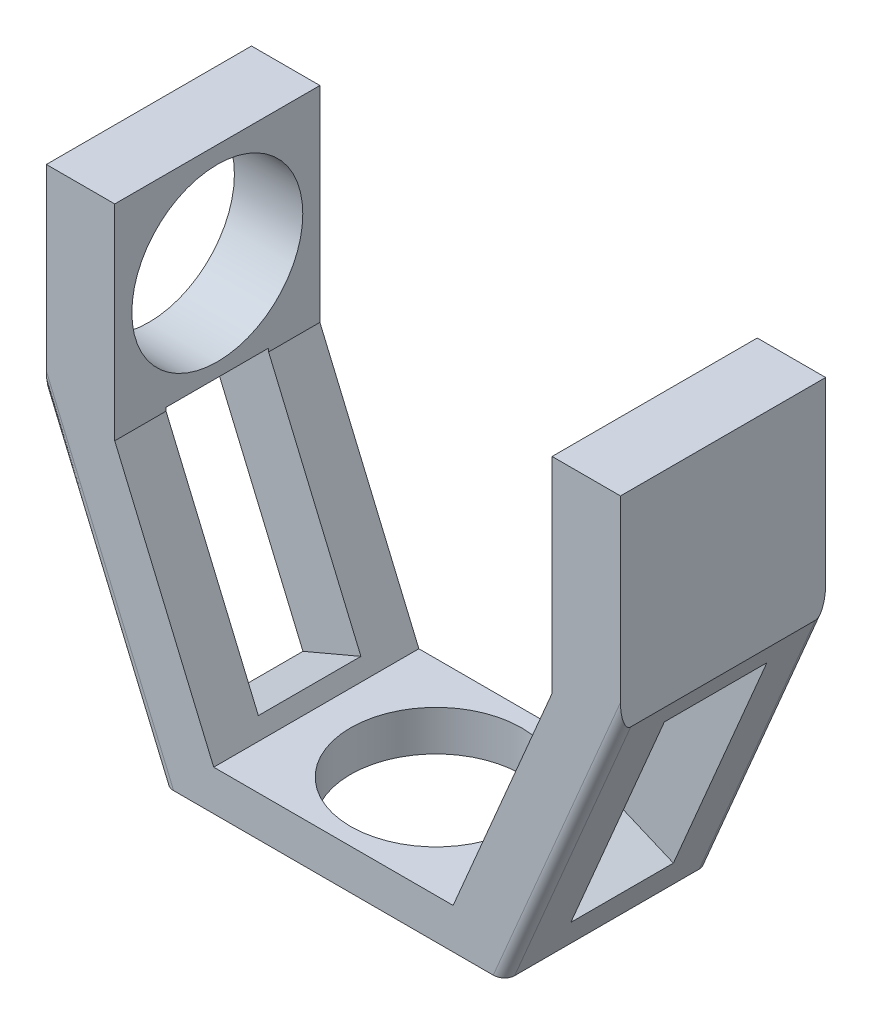
ISO-10303-21;
HEADER;
FILE_DESCRIPTION(('STEP AP214'),'2;1');
FILE_NAME('part.step','',(''),(''),'','','');
FILE_SCHEMA(('AUTOMOTIVE_DESIGN { 1 0 10303 214 1 1 1 1 }'));
ENDSEC;
DATA;
#1=APPLICATION_CONTEXT('core data for automotive mechanical design processes');
#2=APPLICATION_PROTOCOL_DEFINITION('international standard','automotive_design',2000,#1);
#3=PRODUCT_CONTEXT('',#1,'mechanical');
#4=PRODUCT('Part','Part','',(#3));
#5=PRODUCT_RELATED_PRODUCT_CATEGORY('part','',(#4));
#6=PRODUCT_DEFINITION_FORMATION('','',#4);
#7=PRODUCT_DEFINITION_CONTEXT('part definition',#1,'design');
#8=PRODUCT_DEFINITION('design','',#6,#7);
#9=PRODUCT_DEFINITION_SHAPE('','',#8);
#10=(LENGTH_UNIT() NAMED_UNIT(*) SI_UNIT(.MILLI.,.METRE.));
#11=(NAMED_UNIT(*) PLANE_ANGLE_UNIT() SI_UNIT($,.RADIAN.));
#12=(NAMED_UNIT(*) SI_UNIT($,.STERADIAN.) SOLID_ANGLE_UNIT());
#13=UNCERTAINTY_MEASURE_WITH_UNIT(LENGTH_MEASURE(1.E-05),#10,'distance_accuracy_value','');
#14=(GEOMETRIC_REPRESENTATION_CONTEXT(3) GLOBAL_UNCERTAINTY_ASSIGNED_CONTEXT((#13)) GLOBAL_UNIT_ASSIGNED_CONTEXT((#10,
#11,#12)) REPRESENTATION_CONTEXT('',''));
#15=CARTESIAN_POINT('',(0.,0.,0.));
#16=DIRECTION('',(0.,0.,1.));
#17=DIRECTION('',(1.,0.,0.));
#18=AXIS2_PLACEMENT_3D('',#15,#16,#17);
#19=CARTESIAN_POINT('',(6.13187876566639,76.9672773490026,60.));
#20=DIRECTION('',(0.,-1.,0.));
#21=DIRECTION('',(0.,0.,-1.));
#22=AXIS2_PLACEMENT_3D('',#19,#20,#21);
#23=PLANE('',#22);
#24=DIRECTION('',(-1.,0.,0.));
#25=VECTOR('',#24,1.);
#26=CARTESIAN_POINT('',(6.13187876566639,76.9672773490026,0.));
#27=LINE('',#26,#25);
#28=CARTESIAN_POINT('',(6.13187876566639,76.9672773490026,0.));
#29=VERTEX_POINT('',#28);
#30=CARTESIAN_POINT('',(-13.8681212343336,76.9672773490026,0.));
#31=VERTEX_POINT('',#30);
#32=EDGE_CURVE('E351',#29,#31,#27,.T.);
#33=ORIENTED_EDGE('',*,*,#32,.T.);
#34=DIRECTION('',(0.,0.,1.));
#35=VECTOR('',#34,1.);
#36=CARTESIAN_POINT('',(-13.8681212343336,76.9672773490026,0.));
#37=LINE('',#36,#35);
#38=CARTESIAN_POINT('',(-13.8681212343336,76.9672773490026,60.));
#39=VERTEX_POINT('',#38);
#40=EDGE_CURVE('E318',#31,#39,#37,.T.);
#41=ORIENTED_EDGE('',*,*,#40,.T.);
#42=DIRECTION('',(-1.,0.,0.));
#43=VECTOR('',#42,1.);
#44=CARTESIAN_POINT('',(6.13187876566639,76.9672773490026,60.));
#45=LINE('',#44,#43);
#46=CARTESIAN_POINT('',(6.13187876566639,76.9672773490026,60.));
#47=VERTEX_POINT('',#46);
#48=EDGE_CURVE('E339',#47,#39,#45,.T.);
#49=ORIENTED_EDGE('',*,*,#48,.F.);
#50=DIRECTION('',(0.,0.,-1.));
#51=VECTOR('',#50,1.);
#52=CARTESIAN_POINT('',(6.13187876566639,76.9672773490026,60.));
#53=LINE('',#52,#51);
#54=EDGE_CURVE('E369',#47,#29,#53,.T.);
#55=ORIENTED_EDGE('',*,*,#54,.T.);
#56=EDGE_LOOP('',(#33,#41,#49,#55));
#57=FACE_BOUND('',#56,.T.);
#58=ADVANCED_FACE('F37',(#57),#23,.F.);
#59=CARTESIAN_POINT('',(6.13187876566639,16.9672773490026,60.));
#60=DIRECTION('',(-1.,0.,0.));
#61=DIRECTION('',(0.,0.,1.));
#62=AXIS2_PLACEMENT_3D('',#59,#60,#61);
#63=PLANE('',#62);
#64=DIRECTION('',(0.,0.,-1.));
#65=VECTOR('',#64,1.);
#66=CARTESIAN_POINT('',(6.13187876566639,16.9672773490026,60.));
#67=LINE('',#66,#65);
#68=CARTESIAN_POINT('',(6.13187876566639,16.9672773490026,57.));
#69=VERTEX_POINT('',#68);
#70=CARTESIAN_POINT('',(6.13187876566639,16.9672773490026,3.));
#71=VERTEX_POINT('',#70);
#72=EDGE_CURVE('E348',#69,#71,#67,.T.);
#73=ORIENTED_EDGE('',*,*,#72,.T.);
#74=CARTESIAN_POINT('',(6.13187876566639,24.645191344745,3.));
#75=DIRECTION('',(-1.,0.,0.));
#76=DIRECTION('',(0.,1.,0.));
#77=AXIS2_PLACEMENT_3D('',#74,#75,#76);
#78=ELLIPSE('',#77,7.67791399574241,3.);
#79=CARTESIAN_POINT('',(6.13187876566639,24.645191344745,0.));
#80=VERTEX_POINT('',#79);
#81=EDGE_CURVE('E59',#71,#80,#78,.F.);
#82=ORIENTED_EDGE('',*,*,#81,.T.);
#83=DIRECTION('',(0.,1.,0.));
#84=VECTOR('',#83,1.);
#85=CARTESIAN_POINT('',(6.13187876566639,16.9672773490026,0.));
#86=LINE('',#85,#84);
#87=EDGE_CURVE('E321',#80,#29,#86,.T.);
#88=ORIENTED_EDGE('',*,*,#87,.T.);
#89=ORIENTED_EDGE('',*,*,#54,.F.);
#90=DIRECTION('',(0.,1.,0.));
#91=VECTOR('',#90,1.);
#92=CARTESIAN_POINT('',(6.13187876566639,16.9672773490026,60.));
#93=LINE('',#92,#91);
#94=CARTESIAN_POINT('',(6.13187876566639,24.645191344745,60.));
#95=VERTEX_POINT('',#94);
#96=EDGE_CURVE('E335',#95,#47,#93,.T.);
#97=ORIENTED_EDGE('',*,*,#96,.F.);
#98=CARTESIAN_POINT('',(6.13187876566639,24.645191344745,57.));
#99=DIRECTION('',(-1.,0.,0.));
#100=DIRECTION('',(0.,-1.,0.));
#101=AXIS2_PLACEMENT_3D('',#98,#99,#100);
#102=ELLIPSE('',#101,7.67791399574241,3.);
#103=EDGE_CURVE('E415',#95,#69,#102,.F.);
#104=ORIENTED_EDGE('',*,*,#103,.T.);
#105=EDGE_LOOP('',(#73,#82,#88,#89,#97,#104));
#106=FACE_BOUND('',#105,.T.);
#107=ADVANCED_FACE('F430',(#106),#63,.F.);
#108=CARTESIAN_POINT('',(-141.78409182787,76.9672773490026,60.));
#109=VERTEX_POINT('',#108);
#110=CARTESIAN_POINT('',(-161.78409182787,76.9672773490026,60.));
#111=VERTEX_POINT('',#110);
#112=EDGE_CURVE('E337',#109,#111,#45,.T.);
#113=ORIENTED_EDGE('',*,*,#112,.F.);
#114=DIRECTION('',(0.,0.,1.));
#115=VECTOR('',#114,1.);
#116=CARTESIAN_POINT('',(-141.78409182787,76.9672773490026,0.));
#117=LINE('',#116,#115);
#118=CARTESIAN_POINT('',(-141.78409182787,76.9672773490026,0.));
#119=VERTEX_POINT('',#118);
#120=EDGE_CURVE('E305',#119,#109,#117,.T.);
#121=ORIENTED_EDGE('',*,*,#120,.F.);
#122=CARTESIAN_POINT('',(-161.78409182787,76.9672773490026,0.));
#123=VERTEX_POINT('',#122);
#124=EDGE_CURVE('E350',#119,#123,#27,.T.);
#125=ORIENTED_EDGE('',*,*,#124,.T.);
#126=DIRECTION('',(0.,0.,-1.));
#127=VECTOR('',#126,1.);
#128=CARTESIAN_POINT('',(-161.78409182787,76.9672773490026,60.));
#129=LINE('',#128,#127);
#130=EDGE_CURVE('E366',#111,#123,#129,.T.);
#131=ORIENTED_EDGE('',*,*,#130,.F.);
#132=EDGE_LOOP('',(#113,#121,#125,#131));
#133=FACE_BOUND('',#132,.T.);
#134=ADVANCED_FACE('F453',(#133),#23,.F.);
#135=CARTESIAN_POINT('',(-161.78409182787,76.9672773490026,60.));
#136=DIRECTION('',(1.,0.,0.));
#137=DIRECTION('',(0.,1.,0.));
#138=AXIS2_PLACEMENT_3D('',#135,#136,#137);
#139=PLANE('',#138);
#140=CARTESIAN_POINT('',(-161.78409182787,46.9672773490026,30.));
#141=DIRECTION('',(-1.,0.,0.));
#142=DIRECTION('',(0.,-1.,0.));
#143=AXIS2_PLACEMENT_3D('',#140,#141,#142);
#144=CIRCLE('',#143,25.);
#145=CARTESIAN_POINT('',(-161.78409182787,21.9672773490026,30.));
#146=VERTEX_POINT('',#145);
#147=EDGE_CURVE('E282',#146,#146,#144,.T.);
#148=ORIENTED_EDGE('',*,*,#147,.F.);
#149=EDGE_LOOP('',(#148));
#150=FACE_BOUND('',#149,.T.);
#151=DIRECTION('',(0.,0.,-1.));
#152=VECTOR('',#151,1.);
#153=CARTESIAN_POINT('',(-161.78409182787,16.9672773490026,60.));
#154=LINE('',#153,#152);
#155=CARTESIAN_POINT('',(-161.78409182787,16.9672773490026,57.));
#156=VERTEX_POINT('',#155);
#157=CARTESIAN_POINT('',(-161.78409182787,16.9672773490026,3.));
#158=VERTEX_POINT('',#157);
#159=EDGE_CURVE('E364',#156,#158,#154,.T.);
#160=ORIENTED_EDGE('',*,*,#159,.F.);
#161=CARTESIAN_POINT('',(-161.78409182787,24.645191344745,57.));
#162=DIRECTION('',(1.,0.,0.));
#163=DIRECTION('',(0.,1.,0.));
#164=AXIS2_PLACEMENT_3D('',#161,#162,#163);
#165=ELLIPSE('',#164,7.67791399574239,3.);
#166=CARTESIAN_POINT('',(-161.78409182787,24.645191344745,60.));
#167=VERTEX_POINT('',#166);
#168=EDGE_CURVE('E410',#156,#167,#165,.F.);
#169=ORIENTED_EDGE('',*,*,#168,.T.);
#170=DIRECTION('',(0.,-1.,0.));
#171=VECTOR('',#170,1.);
#172=CARTESIAN_POINT('',(-161.78409182787,76.9672773490026,60.));
#173=LINE('',#172,#171);
#174=EDGE_CURVE('E342',#111,#167,#173,.T.);
#175=ORIENTED_EDGE('',*,*,#174,.F.);
#176=ORIENTED_EDGE('',*,*,#130,.T.);
#177=DIRECTION('',(0.,-1.,0.));
#178=VECTOR('',#177,1.);
#179=CARTESIAN_POINT('',(-161.78409182787,76.9672773490026,0.));
#180=LINE('',#179,#178);
#181=CARTESIAN_POINT('',(-161.78409182787,24.645191344745,0.));
#182=VERTEX_POINT('',#181);
#183=EDGE_CURVE('E354',#123,#182,#180,.T.);
#184=ORIENTED_EDGE('',*,*,#183,.T.);
#185=CARTESIAN_POINT('',(-161.78409182787,24.645191344745,3.));
#186=DIRECTION('',(1.,0.,0.));
#187=DIRECTION('',(0.,-1.,0.));
#188=AXIS2_PLACEMENT_3D('',#185,#186,#187);
#189=ELLIPSE('',#188,7.67791399574239,3.);
#190=EDGE_CURVE('E400',#182,#158,#189,.F.);
#191=ORIENTED_EDGE('',*,*,#190,.T.);
#192=EDGE_LOOP('',(#160,#169,#175,#176,#184,#191));
#193=FACE_BOUND('',#192,.T.);
#194=ADVANCED_FACE('F460',(#150,#193),#139,.F.);
#195=CARTESIAN_POINT('',(-161.78409182787,16.9672773490026,60.));
#196=DIRECTION('',(0.920504853452441,0.390731128489271,0.));
#197=DIRECTION('',(-0.390731128489271,0.920504853452442,0.));
#198=AXIS2_PLACEMENT_3D('',#195,#196,#197);
#199=PLANE('',#198);
#200=DIRECTION('',(0.390731128489271,-0.920504853452441,0.));
#201=VECTOR('',#200,1.);
#202=CARTESIAN_POINT('',(-159.084596810243,10.6076656251979,15.));
#203=LINE('',#202,#201);
#204=CARTESIAN_POINT('',(-159.084596810243,10.607665625198,15.));
#205=VERTEX_POINT('',#204);
#206=CARTESIAN_POINT('',(-131.733417815994,-53.827674116473,15.));
#207=VERTEX_POINT('',#206);
#208=EDGE_CURVE('E252',#205,#207,#203,.T.);
#209=ORIENTED_EDGE('',*,*,#208,.F.);
#210=DIRECTION('',(0.,0.,-1.));
#211=VECTOR('',#210,1.);
#212=CARTESIAN_POINT('',(-159.084596810243,10.6076656251979,45.));
#213=LINE('',#212,#211);
#214=CARTESIAN_POINT('',(-159.084596810243,10.6076656251979,45.));
#215=VERTEX_POINT('',#214);
#216=EDGE_CURVE('E250',#215,#205,#213,.T.);
#217=ORIENTED_EDGE('',*,*,#216,.F.);
#218=DIRECTION('',(-0.390731128489271,0.920504853452441,0.));
#219=VECTOR('',#218,1.);
#220=CARTESIAN_POINT('',(-131.733417815994,-53.827674116473,45.));
#221=LINE('',#220,#219);
#222=CARTESIAN_POINT('',(-131.733417815994,-53.827674116473,45.));
#223=VERTEX_POINT('',#222);
#224=EDGE_CURVE('E258',#223,#215,#221,.T.);
#225=ORIENTED_EDGE('',*,*,#224,.F.);
#226=DIRECTION('',(0.,0.,1.));
#227=VECTOR('',#226,1.);
#228=CARTESIAN_POINT('',(-131.733417815994,-53.827674116473,15.));
#229=LINE('',#228,#227);
#230=EDGE_CURVE('E255',#207,#223,#229,.T.);
#231=ORIENTED_EDGE('',*,*,#230,.F.);
#232=EDGE_LOOP('',(#209,#217,#225,#231));
#233=FACE_BOUND('',#232,.T.);
#234=DIRECTION('',(0.,0.,-1.));
#235=VECTOR('',#234,1.);
#236=CARTESIAN_POINT('',(-127.826106531102,-63.0327226509974,60.));
#237=LINE('',#236,#235);
#238=CARTESIAN_POINT('',(-127.826106531102,-63.0327226509974,57.));
#239=VERTEX_POINT('',#238);
#240=CARTESIAN_POINT('',(-127.826106531102,-63.0327226509974,3.));
#241=VERTEX_POINT('',#240);
#242=EDGE_CURVE('E362',#239,#241,#237,.T.);
#243=ORIENTED_EDGE('',*,*,#242,.F.);
#244=DIRECTION('',(0.390731128489271,-0.920504853452442,0.));
#245=VECTOR('',#244,1.);
#246=CARTESIAN_POINT('',(-161.78409182787,16.9672773490026,57.));
#247=LINE('',#246,#245);
#248=EDGE_CURVE('E408',#239,#156,#247,.F.);
#249=ORIENTED_EDGE('',*,*,#248,.T.);
#250=ORIENTED_EDGE('',*,*,#159,.T.);
#251=DIRECTION('',(0.390731128489271,-0.920504853452442,0.));
#252=VECTOR('',#251,1.);
#253=CARTESIAN_POINT('',(-161.78409182787,16.9672773490026,3.));
#254=LINE('',#253,#252);
#255=EDGE_CURVE('E393',#158,#241,#254,.T.);
#256=ORIENTED_EDGE('',*,*,#255,.T.);
#257=EDGE_LOOP('',(#243,#249,#250,#256));
#258=FACE_BOUND('',#257,.T.);
#259=ADVANCED_FACE('F465',(#233,#258),#199,.F.);
#260=CARTESIAN_POINT('',(-127.826106531102,-63.0327226509974,60.));
#261=DIRECTION('',(0.,1.,0.));
#262=DIRECTION('',(0.,0.,1.));
#263=AXIS2_PLACEMENT_3D('',#260,#261,#262);
#264=PLANE('',#263);
#265=CARTESIAN_POINT('',(-77.8157720357696,-63.0327226509974,30.));
#266=DIRECTION('',(0.,1.,0.));
#267=DIRECTION('',(0.,0.,1.));
#268=AXIS2_PLACEMENT_3D('',#265,#266,#267);
#269=CIRCLE('',#268,25.);
#270=CARTESIAN_POINT('',(-77.8157720357696,-63.0327226509974,55.));
#271=VERTEX_POINT('',#270);
#272=EDGE_CURVE('E279',#271,#271,#269,.T.);
#273=ORIENTED_EDGE('',*,*,#272,.T.);
#274=EDGE_LOOP('',(#273));
#275=FACE_BOUND('',#274,.T.);
#276=DIRECTION('',(1.,0.,0.));
#277=VECTOR('',#276,1.);
#278=CARTESIAN_POINT('',(-127.826106531102,-63.0327226509974,0.));
#279=LINE('',#278,#277);
#280=CARTESIAN_POINT('',(-124.567025398886,-63.0327226509974,0.));
#281=VERTEX_POINT('',#280);
#282=CARTESIAN_POINT('',(-31.0851876633176,-63.0327226509974,0.));
#283=VERTEX_POINT('',#282);
#284=EDGE_CURVE('E338',#281,#283,#279,.T.);
#285=ORIENTED_EDGE('',*,*,#284,.T.);
#286=CARTESIAN_POINT('',(-31.0851876633176,-63.0327226509974,3.));
#287=DIRECTION('',(0.,1.,0.));
#288=DIRECTION('',(1.,0.,0.));
#289=AXIS2_PLACEMENT_3D('',#286,#287,#288);
#290=ELLIPSE('',#289,3.25908113221588,3.);
#291=CARTESIAN_POINT('',(-27.8261065311017,-63.0327226509974,3.));
#292=VERTEX_POINT('',#291);
#293=EDGE_CURVE('E11',#283,#292,#290,.F.);
#294=ORIENTED_EDGE('',*,*,#293,.T.);
#295=DIRECTION('',(0.,0.,-1.));
#296=VECTOR('',#295,1.);
#297=CARTESIAN_POINT('',(-27.8261065311017,-63.0327226509974,60.));
#298=LINE('',#297,#296);
#299=CARTESIAN_POINT('',(-27.8261065311017,-63.0327226509974,57.));
#300=VERTEX_POINT('',#299);
#301=EDGE_CURVE('E359',#300,#292,#298,.T.);
#302=ORIENTED_EDGE('',*,*,#301,.F.);
#303=CARTESIAN_POINT('',(-31.0851876633176,-63.0327226509974,57.));
#304=DIRECTION('',(0.,1.,0.));
#305=DIRECTION('',(-1.,0.,0.));
#306=AXIS2_PLACEMENT_3D('',#303,#304,#305);
#307=ELLIPSE('',#306,3.25908113221588,3.);
#308=CARTESIAN_POINT('',(-31.0851876633176,-63.0327226509974,60.));
#309=VERTEX_POINT('',#308);
#310=EDGE_CURVE('E419',#300,#309,#307,.F.);
#311=ORIENTED_EDGE('',*,*,#310,.T.);
#312=DIRECTION('',(1.,0.,0.));
#313=VECTOR('',#312,1.);
#314=CARTESIAN_POINT('',(-127.826106531102,-63.0327226509974,60.));
#315=LINE('',#314,#313);
#316=CARTESIAN_POINT('',(-124.567025398886,-63.0327226509974,60.));
#317=VERTEX_POINT('',#316);
#318=EDGE_CURVE('E345',#317,#309,#315,.T.);
#319=ORIENTED_EDGE('',*,*,#318,.F.);
#320=CARTESIAN_POINT('',(-124.567025398886,-63.0327226509974,57.));
#321=DIRECTION('',(0.,1.,0.));
#322=DIRECTION('',(-1.,0.,0.));
#323=AXIS2_PLACEMENT_3D('',#320,#321,#322);
#324=ELLIPSE('',#323,3.25908113221588,3.);
#325=EDGE_CURVE('E406',#317,#239,#324,.F.);
#326=ORIENTED_EDGE('',*,*,#325,.T.);
#327=ORIENTED_EDGE('',*,*,#242,.T.);
#328=CARTESIAN_POINT('',(-124.567025398886,-63.0327226509974,3.));
#329=DIRECTION('',(0.,1.,0.));
#330=DIRECTION('',(1.,0.,0.));
#331=AXIS2_PLACEMENT_3D('',#328,#329,#330);
#332=ELLIPSE('',#331,3.25908113221588,3.);
#333=EDGE_CURVE('E396',#241,#281,#332,.F.);
#334=ORIENTED_EDGE('',*,*,#333,.T.);
#335=EDGE_LOOP('',(#285,#294,#302,#311,#319,#326,#327,#334));
#336=FACE_BOUND('',#335,.T.);
#337=ADVANCED_FACE('F443',(#275,#336),#264,.F.);
#338=CARTESIAN_POINT('',(-27.8261065311017,-63.0327226509974,60.));
#339=DIRECTION('',(-0.920504853452441,0.390731128489271,0.));
#340=DIRECTION('',(-0.390731128489271,-0.920504853452442,0.));
#341=AXIS2_PLACEMENT_3D('',#338,#339,#340);
#342=PLANE('',#341);
#343=DIRECTION('',(-0.390731128489271,-0.920504853452441,0.));
#344=VECTOR('',#343,1.);
#345=CARTESIAN_POINT('',(3.43238374803998,10.6076656251979,44.4734036367231));
#346=LINE('',#345,#344);
#347=CARTESIAN_POINT('',(3.43238374803999,10.6076656251979,44.4734036367231));
#348=VERTEX_POINT('',#347);
#349=CARTESIAN_POINT('',(-23.918795246209,-53.827674116473,44.4734036367231));
#350=VERTEX_POINT('',#349);
#351=EDGE_CURVE('E225',#348,#350,#346,.T.);
#352=ORIENTED_EDGE('',*,*,#351,.F.);
#353=DIRECTION('',(0.,0.,1.));
#354=VECTOR('',#353,1.);
#355=CARTESIAN_POINT('',(3.43238374803998,10.6076656251979,14.4734036367231));
#356=LINE('',#355,#354);
#357=CARTESIAN_POINT('',(3.43238374803998,10.6076656251979,14.4734036367231));
#358=VERTEX_POINT('',#357);
#359=EDGE_CURVE('E230',#358,#348,#356,.T.);
#360=ORIENTED_EDGE('',*,*,#359,.F.);
#361=DIRECTION('',(0.390731128489271,0.920504853452442,0.));
#362=VECTOR('',#361,1.);
#363=CARTESIAN_POINT('',(-23.918795246209,-53.827674116473,14.4734036367231));
#364=LINE('',#363,#362);
#365=CARTESIAN_POINT('',(-23.918795246209,-53.827674116473,14.4734036367231));
#366=VERTEX_POINT('',#365);
#367=EDGE_CURVE('E235',#366,#358,#364,.T.);
#368=ORIENTED_EDGE('',*,*,#367,.F.);
#369=DIRECTION('',(0.,0.,-1.));
#370=VECTOR('',#369,1.);
#371=CARTESIAN_POINT('',(-23.918795246209,-53.827674116473,44.4734036367231));
#372=LINE('',#371,#370);
#373=EDGE_CURVE('E214',#350,#366,#372,.T.);
#374=ORIENTED_EDGE('',*,*,#373,.F.);
#375=EDGE_LOOP('',(#352,#360,#368,#374));
#376=FACE_BOUND('',#375,.T.);
#377=ORIENTED_EDGE('',*,*,#301,.T.);
#378=DIRECTION('',(0.390731128489271,0.920504853452442,0.));
#379=VECTOR('',#378,1.);
#380=CARTESIAN_POINT('',(-27.8261065311017,-63.0327226509974,3.));
#381=LINE('',#380,#379);
#382=EDGE_CURVE('E421',#292,#71,#381,.T.);
#383=ORIENTED_EDGE('',*,*,#382,.T.);
#384=ORIENTED_EDGE('',*,*,#72,.F.);
#385=DIRECTION('',(0.390731128489271,0.920504853452442,0.));
#386=VECTOR('',#385,1.);
#387=CARTESIAN_POINT('',(-27.8261065311017,-63.0327226509974,57.));
#388=LINE('',#387,#386);
#389=EDGE_CURVE('E417',#69,#300,#388,.F.);
#390=ORIENTED_EDGE('',*,*,#389,.T.);
#391=EDGE_LOOP('',(#377,#383,#384,#390));
#392=FACE_BOUND('',#391,.T.);
#393=ADVANCED_FACE('F232',(#376,#392),#342,.F.);
#394=CARTESIAN_POINT('',(0.,0.,60.));
#395=DIRECTION('',(0.,0.,1.));
#396=DIRECTION('',(1.,0.,0.));
#397=AXIS2_PLACEMENT_3D('',#394,#395,#396);
#398=PLANE('',#397);
#399=ORIENTED_EDGE('',*,*,#318,.T.);
#400=DIRECTION('',(0.390731128489271,0.920504853452442,0.));
#401=VECTOR('',#400,1.);
#402=CARTESIAN_POINT('',(3.37036420530907,18.1394707344704,60.));
#403=LINE('',#402,#401);
#404=EDGE_CURVE('E412',#309,#95,#403,.T.);
#405=ORIENTED_EDGE('',*,*,#404,.T.);
#406=ORIENTED_EDGE('',*,*,#96,.T.);
#407=ORIENTED_EDGE('',*,*,#48,.T.);
#408=DIRECTION('',(0.,1.,0.));
#409=VECTOR('',#408,1.);
#410=CARTESIAN_POINT('',(-13.8681212343336,76.9672773490026,60.));
#411=LINE('',#410,#409);
#412=CARTESIAN_POINT('',(-13.8681212343336,16.9672773490026,60.));
#413=VERTEX_POINT('',#412);
#414=EDGE_CURVE('E293',#413,#39,#411,.T.);
#415=ORIENTED_EDGE('',*,*,#414,.F.);
#416=DIRECTION('',(0.390731128489271,0.920504853452442,0.));
#417=VECTOR('',#416,1.);
#418=CARTESIAN_POINT('',(-42.8157720357696,-51.2291142766008,60.));
#419=LINE('',#418,#417);
#420=CARTESIAN_POINT('',(-42.8157720357696,-51.2291142766008,60.));
#421=VERTEX_POINT('',#420);
#422=EDGE_CURVE('E314',#421,#413,#419,.T.);
#423=ORIENTED_EDGE('',*,*,#422,.F.);
#424=DIRECTION('',(1.,0.,0.));
#425=VECTOR('',#424,1.);
#426=CARTESIAN_POINT('',(-112.836441026434,-51.2291142766008,60.));
#427=LINE('',#426,#425);
#428=CARTESIAN_POINT('',(-112.836441026434,-51.2291142766008,60.));
#429=VERTEX_POINT('',#428);
#430=EDGE_CURVE('E311',#429,#421,#427,.T.);
#431=ORIENTED_EDGE('',*,*,#430,.F.);
#432=DIRECTION('',(0.390731128489271,-0.920504853452441,0.));
#433=VECTOR('',#432,1.);
#434=CARTESIAN_POINT('',(-141.78409182787,16.9672773490026,60.));
#435=LINE('',#434,#433);
#436=CARTESIAN_POINT('',(-141.78409182787,16.9672773490026,60.));
#437=VERTEX_POINT('',#436);
#438=EDGE_CURVE('E308',#437,#429,#435,.T.);
#439=ORIENTED_EDGE('',*,*,#438,.F.);
#440=DIRECTION('',(0.,-1.,0.));
#441=VECTOR('',#440,1.);
#442=CARTESIAN_POINT('',(-141.78409182787,76.9672773490026,60.));
#443=LINE('',#442,#441);
#444=EDGE_CURVE('E286',#109,#437,#443,.T.);
#445=ORIENTED_EDGE('',*,*,#444,.F.);
#446=ORIENTED_EDGE('',*,*,#112,.T.);
#447=ORIENTED_EDGE('',*,*,#174,.T.);
#448=DIRECTION('',(0.390731128489271,-0.920504853452442,0.));
#449=VECTOR('',#448,1.);
#450=CARTESIAN_POINT('',(-125.064591970744,-61.8605292655296,60.));
#451=LINE('',#450,#449);
#452=EDGE_CURVE('E403',#167,#317,#451,.T.);
#453=ORIENTED_EDGE('',*,*,#452,.T.);
#454=EDGE_LOOP('',(#399,#405,#406,#407,#415,#423,#431,#439,#445,#446,#447,#453));
#455=FACE_BOUND('',#454,.T.);
#456=ADVANCED_FACE('F438',(#455),#398,.T.);
#457=CARTESIAN_POINT('',(0.,0.,0.));
#458=DIRECTION('',(0.,0.,1.));
#459=DIRECTION('',(1.,0.,0.));
#460=AXIS2_PLACEMENT_3D('',#457,#458,#459);
#461=PLANE('',#460);
#462=ORIENTED_EDGE('',*,*,#87,.F.);
#463=DIRECTION('',(0.390731128489271,0.920504853452442,0.));
#464=VECTOR('',#463,1.);
#465=CARTESIAN_POINT('',(-3.66841367218013,1.55714921927945,0.));
#466=LINE('',#465,#464);
#467=EDGE_CURVE('E45',#80,#283,#466,.F.);
#468=ORIENTED_EDGE('',*,*,#467,.T.);
#469=ORIENTED_EDGE('',*,*,#284,.F.);
#470=DIRECTION('',(0.390731128489271,-0.920504853452442,0.));
#471=VECTOR('',#470,1.);
#472=CARTESIAN_POINT('',(-128.220249200985,-54.4262667139375,0.));
#473=LINE('',#472,#471);
#474=EDGE_CURVE('E398',#281,#182,#473,.F.);
#475=ORIENTED_EDGE('',*,*,#474,.T.);
#476=ORIENTED_EDGE('',*,*,#183,.F.);
#477=ORIENTED_EDGE('',*,*,#124,.F.);
#478=DIRECTION('',(0.,-1.,0.));
#479=VECTOR('',#478,1.);
#480=CARTESIAN_POINT('',(-141.78409182787,76.9672773490026,0.));
#481=LINE('',#480,#479);
#482=CARTESIAN_POINT('',(-141.78409182787,16.9672773490026,0.));
#483=VERTEX_POINT('',#482);
#484=EDGE_CURVE('E289',#119,#483,#481,.T.);
#485=ORIENTED_EDGE('',*,*,#484,.T.);
#486=DIRECTION('',(0.390731128489271,-0.920504853452441,0.));
#487=VECTOR('',#486,1.);
#488=CARTESIAN_POINT('',(-141.78409182787,16.9672773490026,0.));
#489=LINE('',#488,#487);
#490=CARTESIAN_POINT('',(-112.836441026434,-51.2291142766008,0.));
#491=VERTEX_POINT('',#490);
#492=EDGE_CURVE('E292',#483,#491,#489,.T.);
#493=ORIENTED_EDGE('',*,*,#492,.T.);
#494=DIRECTION('',(1.,0.,0.));
#495=VECTOR('',#494,1.);
#496=CARTESIAN_POINT('',(-112.836441026434,-51.2291142766008,0.));
#497=LINE('',#496,#495);
#498=CARTESIAN_POINT('',(-42.8157720357696,-51.2291142766008,0.));
#499=VERTEX_POINT('',#498);
#500=EDGE_CURVE('E296',#491,#499,#497,.T.);
#501=ORIENTED_EDGE('',*,*,#500,.T.);
#502=DIRECTION('',(0.390731128489271,0.920504853452442,0.));
#503=VECTOR('',#502,1.);
#504=CARTESIAN_POINT('',(-42.8157720357696,-51.2291142766008,0.));
#505=LINE('',#504,#503);
#506=CARTESIAN_POINT('',(-13.8681212343336,16.9672773490026,0.));
#507=VERTEX_POINT('',#506);
#508=EDGE_CURVE('E299',#499,#507,#505,.T.);
#509=ORIENTED_EDGE('',*,*,#508,.T.);
#510=DIRECTION('',(0.,1.,0.));
#511=VECTOR('',#510,1.);
#512=CARTESIAN_POINT('',(-13.8681212343336,76.9672773490026,0.));
#513=LINE('',#512,#511);
#514=EDGE_CURVE('E302',#507,#31,#513,.T.);
#515=ORIENTED_EDGE('',*,*,#514,.T.);
#516=ORIENTED_EDGE('',*,*,#32,.F.);
#517=EDGE_LOOP('',(#462,#468,#469,#475,#476,#477,#485,#493,#501,#509,#515,#516));
#518=FACE_BOUND('',#517,.T.);
#519=ADVANCED_FACE('F479',(#518),#461,.F.);
#520=CARTESIAN_POINT('',(-13.8681212343336,76.9672773490026,0.));
#521=DIRECTION('',(1.,0.,0.));
#522=DIRECTION('',(0.,1.,0.));
#523=AXIS2_PLACEMENT_3D('',#520,#521,#522);
#524=PLANE('',#523);
#525=DIRECTION('',(0.,0.,1.));
#526=VECTOR('',#525,1.);
#527=CARTESIAN_POINT('',(-13.8681212343336,16.9672773490026,0.));
#528=LINE('',#527,#526);
#529=CARTESIAN_POINT('',(-13.8681212343336,16.9672773490026,14.4734036367231));
#530=VERTEX_POINT('',#529);
#531=EDGE_CURVE('E322',#507,#530,#528,.T.);
#532=ORIENTED_EDGE('',*,*,#531,.T.);
#533=DIRECTION('',(0.,1.,0.));
#534=VECTOR('',#533,1.);
#535=CARTESIAN_POINT('',(-13.8681212343336,76.9672773490026,14.4734036367231));
#536=LINE('',#535,#534);
#537=CARTESIAN_POINT('',(-13.8681212343336,17.9512942979243,14.4734036367231));
#538=VERTEX_POINT('',#537);
#539=EDGE_CURVE('E247',#530,#538,#536,.T.);
#540=ORIENTED_EDGE('',*,*,#539,.T.);
#541=DIRECTION('',(0.,0.,1.));
#542=VECTOR('',#541,1.);
#543=CARTESIAN_POINT('',(-13.8681212343336,17.9512942979243,0.));
#544=LINE('',#543,#542);
#545=CARTESIAN_POINT('',(-13.8681212343336,17.9512942979243,44.4734036367231));
#546=VERTEX_POINT('',#545);
#547=EDGE_CURVE('E390',#538,#546,#544,.T.);
#548=ORIENTED_EDGE('',*,*,#547,.T.);
#549=DIRECTION('',(0.,-1.,0.));
#550=VECTOR('',#549,1.);
#551=CARTESIAN_POINT('',(-13.8681212343336,76.9672773490026,44.4734036367231));
#552=LINE('',#551,#550);
#553=CARTESIAN_POINT('',(-13.8681212343336,16.9672773490026,44.4734036367231));
#554=VERTEX_POINT('',#553);
#555=EDGE_CURVE('E242',#546,#554,#552,.T.);
#556=ORIENTED_EDGE('',*,*,#555,.T.);
#557=EDGE_CURVE('E325',#554,#413,#528,.T.);
#558=ORIENTED_EDGE('',*,*,#557,.T.);
#559=ORIENTED_EDGE('',*,*,#414,.T.);
#560=ORIENTED_EDGE('',*,*,#40,.F.);
#561=ORIENTED_EDGE('',*,*,#514,.F.);
#562=EDGE_LOOP('',(#532,#540,#548,#556,#558,#559,#560,#561));
#563=FACE_BOUND('',#562,.T.);
#564=ADVANCED_FACE('F536',(#563),#524,.F.);
#565=CARTESIAN_POINT('',(-42.8157720357696,-51.2291142766008,0.));
#566=DIRECTION('',(0.920504853452441,-0.390731128489271,0.));
#567=DIRECTION('',(0.390731128489271,0.920504853452442,0.));
#568=AXIS2_PLACEMENT_3D('',#565,#566,#567);
#569=PLANE('',#568);
#570=DIRECTION('',(0.,0.,-1.));
#571=VECTOR('',#570,1.);
#572=CARTESIAN_POINT('',(-40.865378950799,-46.6342761130865,0.));
#573=LINE('',#572,#571);
#574=CARTESIAN_POINT('',(-40.865378950799,-46.6342761130865,44.4734036367231));
#575=VERTEX_POINT('',#574);
#576=CARTESIAN_POINT('',(-40.865378950799,-46.6342761130865,14.4734036367231));
#577=VERTEX_POINT('',#576);
#578=EDGE_CURVE('E217',#575,#577,#573,.T.);
#579=ORIENTED_EDGE('',*,*,#578,.T.);
#580=DIRECTION('',(0.390731128489271,0.920504853452442,0.));
#581=VECTOR('',#580,1.);
#582=CARTESIAN_POINT('',(-42.8157720357696,-51.2291142766008,14.4734036367231));
#583=LINE('',#582,#581);
#584=EDGE_CURVE('E387',#577,#530,#583,.T.);
#585=ORIENTED_EDGE('',*,*,#584,.T.);
#586=ORIENTED_EDGE('',*,*,#531,.F.);
#587=ORIENTED_EDGE('',*,*,#508,.F.);
#588=DIRECTION('',(0.,0.,1.));
#589=VECTOR('',#588,1.);
#590=CARTESIAN_POINT('',(-42.8157720357696,-51.2291142766008,0.));
#591=LINE('',#590,#589);
#592=EDGE_CURVE('E326',#499,#421,#591,.T.);
#593=ORIENTED_EDGE('',*,*,#592,.T.);
#594=ORIENTED_EDGE('',*,*,#422,.T.);
#595=ORIENTED_EDGE('',*,*,#557,.F.);
#596=DIRECTION('',(-0.390731128489271,-0.920504853452442,0.));
#597=VECTOR('',#596,1.);
#598=CARTESIAN_POINT('',(-42.8157720357696,-51.2291142766008,44.4734036367231));
#599=LINE('',#598,#597);
#600=EDGE_CURVE('E384',#554,#575,#599,.T.);
#601=ORIENTED_EDGE('',*,*,#600,.T.);
#602=EDGE_LOOP('',(#579,#585,#586,#587,#593,#594,#595,#601));
#603=FACE_BOUND('',#602,.T.);
#604=ADVANCED_FACE('F539',(#603),#569,.F.);
#605=CARTESIAN_POINT('',(-112.836441026434,-51.2291142766008,0.));
#606=DIRECTION('',(0.,-1.,0.));
#607=DIRECTION('',(0.,0.,-1.));
#608=AXIS2_PLACEMENT_3D('',#605,#606,#607);
#609=PLANE('',#608);
#610=CARTESIAN_POINT('',(-77.8157720357696,-51.2291142766008,30.));
#611=DIRECTION('',(0.,1.,0.));
#612=DIRECTION('',(0.,0.,1.));
#613=AXIS2_PLACEMENT_3D('',#610,#611,#612);
#614=CIRCLE('',#613,25.);
#615=CARTESIAN_POINT('',(-77.8157720357696,-51.2291142766008,55.));
#616=VERTEX_POINT('',#615);
#617=EDGE_CURVE('E276',#616,#616,#614,.T.);
#618=ORIENTED_EDGE('',*,*,#617,.F.);
#619=EDGE_LOOP('',(#618));
#620=FACE_BOUND('',#619,.T.);
#621=ORIENTED_EDGE('',*,*,#430,.T.);
#622=ORIENTED_EDGE('',*,*,#592,.F.);
#623=ORIENTED_EDGE('',*,*,#500,.F.);
#624=DIRECTION('',(0.,0.,1.));
#625=VECTOR('',#624,1.);
#626=CARTESIAN_POINT('',(-112.836441026434,-51.2291142766008,0.));
#627=LINE('',#626,#625);
#628=EDGE_CURVE('E328',#491,#429,#627,.T.);
#629=ORIENTED_EDGE('',*,*,#628,.T.);
#630=EDGE_LOOP('',(#621,#622,#623,#629));
#631=FACE_BOUND('',#630,.T.);
#632=ADVANCED_FACE('F543',(#620,#631),#609,.F.);
#633=CARTESIAN_POINT('',(-141.78409182787,16.9672773490026,0.));
#634=DIRECTION('',(-0.920504853452441,-0.390731128489271,0.));
#635=DIRECTION('',(0.390731128489271,-0.920504853452441,0.));
#636=AXIS2_PLACEMENT_3D('',#633,#634,#635);
#637=PLANE('',#636);
#638=DIRECTION('',(0.,0.,1.));
#639=VECTOR('',#638,1.);
#640=CARTESIAN_POINT('',(-114.786834111404,-46.6342761130865,0.));
#641=LINE('',#640,#639);
#642=CARTESIAN_POINT('',(-114.786834111404,-46.6342761130865,15.));
#643=VERTEX_POINT('',#642);
#644=CARTESIAN_POINT('',(-114.786834111404,-46.6342761130865,45.));
#645=VERTEX_POINT('',#644);
#646=EDGE_CURVE('E381',#643,#645,#641,.T.);
#647=ORIENTED_EDGE('',*,*,#646,.T.);
#648=DIRECTION('',(-0.390731128489271,0.920504853452441,0.));
#649=VECTOR('',#648,1.);
#650=CARTESIAN_POINT('',(-141.78409182787,16.9672773490026,45.));
#651=LINE('',#650,#649);
#652=CARTESIAN_POINT('',(-141.78409182787,16.9672773490026,45.));
#653=VERTEX_POINT('',#652);
#654=EDGE_CURVE('E273',#645,#653,#651,.T.);
#655=ORIENTED_EDGE('',*,*,#654,.T.);
#656=DIRECTION('',(0.,0.,1.));
#657=VECTOR('',#656,1.);
#658=CARTESIAN_POINT('',(-141.78409182787,16.9672773490026,0.));
#659=LINE('',#658,#657);
#660=EDGE_CURVE('E333',#653,#437,#659,.T.);
#661=ORIENTED_EDGE('',*,*,#660,.T.);
#662=ORIENTED_EDGE('',*,*,#438,.T.);
#663=ORIENTED_EDGE('',*,*,#628,.F.);
#664=ORIENTED_EDGE('',*,*,#492,.F.);
#665=CARTESIAN_POINT('',(-141.78409182787,16.9672773490026,15.));
#666=VERTEX_POINT('',#665);
#667=EDGE_CURVE('E330',#483,#666,#659,.T.);
#668=ORIENTED_EDGE('',*,*,#667,.T.);
#669=DIRECTION('',(0.390731128489271,-0.920504853452441,0.));
#670=VECTOR('',#669,1.);
#671=CARTESIAN_POINT('',(-141.78409182787,16.9672773490026,15.));
#672=LINE('',#671,#670);
#673=EDGE_CURVE('E264',#666,#643,#672,.T.);
#674=ORIENTED_EDGE('',*,*,#673,.T.);
#675=EDGE_LOOP('',(#647,#655,#661,#662,#663,#664,#668,#674));
#676=FACE_BOUND('',#675,.T.);
#677=ADVANCED_FACE('F547',(#676),#637,.F.);
#678=CARTESIAN_POINT('',(-141.78409182787,76.9672773490026,0.));
#679=DIRECTION('',(-1.,0.,0.));
#680=DIRECTION('',(0.,0.,1.));
#681=AXIS2_PLACEMENT_3D('',#678,#679,#680);
#682=PLANE('',#681);
#683=CARTESIAN_POINT('',(-141.78409182787,46.9672773490026,30.));
#684=DIRECTION('',(-1.,0.,0.));
#685=DIRECTION('',(0.,-1.,0.));
#686=AXIS2_PLACEMENT_3D('',#683,#684,#685);
#687=CIRCLE('',#686,25.);
#688=CARTESIAN_POINT('',(-141.78409182787,21.9672773490026,30.));
#689=VERTEX_POINT('',#688);
#690=EDGE_CURVE('E283',#689,#689,#687,.T.);
#691=ORIENTED_EDGE('',*,*,#690,.T.);
#692=EDGE_LOOP('',(#691));
#693=FACE_BOUND('',#692,.T.);
#694=ORIENTED_EDGE('',*,*,#660,.F.);
#695=DIRECTION('',(0.,1.,0.));
#696=VECTOR('',#695,1.);
#697=CARTESIAN_POINT('',(-141.78409182787,76.9672773490026,45.));
#698=LINE('',#697,#696);
#699=CARTESIAN_POINT('',(-141.78409182787,17.9512942979243,45.));
#700=VERTEX_POINT('',#699);
#701=EDGE_CURVE('E378',#653,#700,#698,.T.);
#702=ORIENTED_EDGE('',*,*,#701,.T.);
#703=DIRECTION('',(0.,0.,-1.));
#704=VECTOR('',#703,1.);
#705=CARTESIAN_POINT('',(-141.78409182787,17.9512942979243,0.));
#706=LINE('',#705,#704);
#707=CARTESIAN_POINT('',(-141.78409182787,17.9512942979243,15.));
#708=VERTEX_POINT('',#707);
#709=EDGE_CURVE('E375',#700,#708,#706,.T.);
#710=ORIENTED_EDGE('',*,*,#709,.T.);
#711=DIRECTION('',(0.,-1.,0.));
#712=VECTOR('',#711,1.);
#713=CARTESIAN_POINT('',(-141.78409182787,76.9672773490026,15.));
#714=LINE('',#713,#712);
#715=EDGE_CURVE('E372',#708,#666,#714,.T.);
#716=ORIENTED_EDGE('',*,*,#715,.T.);
#717=ORIENTED_EDGE('',*,*,#667,.F.);
#718=ORIENTED_EDGE('',*,*,#484,.F.);
#719=ORIENTED_EDGE('',*,*,#120,.T.);
#720=ORIENTED_EDGE('',*,*,#444,.T.);
#721=EDGE_LOOP('',(#694,#702,#710,#716,#717,#718,#719,#720));
#722=FACE_BOUND('',#721,.T.);
#723=ADVANCED_FACE('F477',(#693,#722),#682,.F.);
#724=CARTESIAN_POINT('',(-141.78409182787,46.9672773490026,30.));
#725=DIRECTION('',(-1.,0.,0.));
#726=DIRECTION('',(0.,-1.,0.));
#727=AXIS2_PLACEMENT_3D('',#724,#725,#726);
#728=CYLINDRICAL_SURFACE('',#727,25.);
#729=ORIENTED_EDGE('',*,*,#690,.F.);
#730=EDGE_LOOP('',(#729));
#731=FACE_BOUND('',#730,.T.);
#732=ORIENTED_EDGE('',*,*,#147,.T.);
#733=EDGE_LOOP('',(#732));
#734=FACE_BOUND('',#733,.T.);
#735=ADVANCED_FACE('F531',(#731,#734),#728,.F.);
#736=CARTESIAN_POINT('',(-77.8157720357696,-71.2291142766008,30.));
#737=DIRECTION('',(0.,1.,0.));
#738=DIRECTION('',(0.,0.,1.));
#739=AXIS2_PLACEMENT_3D('',#736,#737,#738);
#740=CYLINDRICAL_SURFACE('',#739,25.);
#741=ORIENTED_EDGE('',*,*,#617,.T.);
#742=EDGE_LOOP('',(#741));
#743=FACE_BOUND('',#742,.T.);
#744=ORIENTED_EDGE('',*,*,#272,.F.);
#745=EDGE_LOOP('',(#744));
#746=FACE_BOUND('',#745,.T.);
#747=ADVANCED_FACE('F521',(#743,#746),#740,.F.);
#748=CARTESIAN_POINT('',(-113.323320746946,-46.0130515466876,15.));
#749=DIRECTION('',(0.390731128489271,-0.920504853452441,0.));
#750=DIRECTION('',(0.920504853452441,0.390731128489271,0.));
#751=AXIS2_PLACEMENT_3D('',#748,#749,#750);
#752=PLANE('',#751);
#753=DIRECTION('',(-0.920504853452441,-0.390731128489271,0.));
#754=VECTOR('',#753,1.);
#755=CARTESIAN_POINT('',(-113.323320746946,-46.0130515466876,15.));
#756=LINE('',#755,#754);
#757=EDGE_CURVE('E267',#643,#207,#756,.T.);
#758=ORIENTED_EDGE('',*,*,#757,.T.);
#759=ORIENTED_EDGE('',*,*,#230,.T.);
#760=DIRECTION('',(-0.920504853452441,-0.390731128489271,0.));
#761=VECTOR('',#760,1.);
#762=CARTESIAN_POINT('',(-113.323320746946,-46.0130515466876,45.));
#763=LINE('',#762,#761);
#764=EDGE_CURVE('E265',#645,#223,#763,.T.);
#765=ORIENTED_EDGE('',*,*,#764,.F.);
#766=ORIENTED_EDGE('',*,*,#646,.F.);
#767=EDGE_LOOP('',(#758,#759,#765,#766));
#768=FACE_BOUND('',#767,.T.);
#769=ADVANCED_FACE('F518',(#768),#752,.F.);
#770=CARTESIAN_POINT('',(-140.674499741195,18.4222881949834,45.));
#771=DIRECTION('',(-0.390731128489271,0.920504853452441,0.));
#772=DIRECTION('',(-0.920504853452441,-0.390731128489271,0.));
#773=AXIS2_PLACEMENT_3D('',#770,#771,#772);
#774=PLANE('',#773);
#775=DIRECTION('',(-0.920504853452441,-0.390731128489271,0.));
#776=VECTOR('',#775,1.);
#777=CARTESIAN_POINT('',(-140.674499741195,18.4222881949834,45.));
#778=LINE('',#777,#776);
#779=EDGE_CURVE('E262',#700,#215,#778,.T.);
#780=ORIENTED_EDGE('',*,*,#779,.T.);
#781=ORIENTED_EDGE('',*,*,#216,.T.);
#782=DIRECTION('',(-0.920504853452441,-0.390731128489271,0.));
#783=VECTOR('',#782,1.);
#784=CARTESIAN_POINT('',(-140.674499741195,18.4222881949834,15.));
#785=LINE('',#784,#783);
#786=EDGE_CURVE('E261',#708,#205,#785,.T.);
#787=ORIENTED_EDGE('',*,*,#786,.F.);
#788=ORIENTED_EDGE('',*,*,#709,.F.);
#789=EDGE_LOOP('',(#780,#781,#787,#788));
#790=FACE_BOUND('',#789,.T.);
#791=ADVANCED_FACE('F516',(#790),#774,.F.);
#792=CARTESIAN_POINT('',(-113.323320746946,-46.0130515466876,45.));
#793=DIRECTION('',(0.,0.,1.));
#794=DIRECTION('',(1.,0.,0.));
#795=AXIS2_PLACEMENT_3D('',#792,#793,#794);
#796=PLANE('',#795);
#797=ORIENTED_EDGE('',*,*,#764,.T.);
#798=ORIENTED_EDGE('',*,*,#224,.T.);
#799=ORIENTED_EDGE('',*,*,#779,.F.);
#800=ORIENTED_EDGE('',*,*,#701,.F.);
#801=ORIENTED_EDGE('',*,*,#654,.F.);
#802=EDGE_LOOP('',(#797,#798,#799,#800,#801));
#803=FACE_BOUND('',#802,.T.);
#804=ADVANCED_FACE('F513',(#803),#796,.F.);
#805=CARTESIAN_POINT('',(-140.674499741195,18.4222881949834,15.));
#806=DIRECTION('',(0.,0.,-1.));
#807=DIRECTION('',(0.,1.,0.));
#808=AXIS2_PLACEMENT_3D('',#805,#806,#807);
#809=PLANE('',#808);
#810=ORIENTED_EDGE('',*,*,#715,.F.);
#811=ORIENTED_EDGE('',*,*,#786,.T.);
#812=ORIENTED_EDGE('',*,*,#208,.T.);
#813=ORIENTED_EDGE('',*,*,#757,.F.);
#814=ORIENTED_EDGE('',*,*,#673,.F.);
#815=EDGE_LOOP('',(#810,#811,#812,#813,#814));
#816=FACE_BOUND('',#815,.T.);
#817=ADVANCED_FACE('F511',(#816),#809,.F.);
#818=CARTESIAN_POINT('',(-14.9777133210089,18.4222881949834,14.4734036367231));
#819=DIRECTION('',(0.390731128489271,0.920504853452441,0.));
#820=DIRECTION('',(-0.920504853452441,0.390731128489271,0.));
#821=AXIS2_PLACEMENT_3D('',#818,#819,#820);
#822=PLANE('',#821);
#823=DIRECTION('',(0.920504853452441,-0.390731128489271,0.));
#824=VECTOR('',#823,1.);
#825=CARTESIAN_POINT('',(-14.9777133210089,18.4222881949834,14.4734036367231));
#826=LINE('',#825,#824);
#827=EDGE_CURVE('E240',#538,#358,#826,.T.);
#828=ORIENTED_EDGE('',*,*,#827,.T.);
#829=ORIENTED_EDGE('',*,*,#359,.T.);
#830=DIRECTION('',(0.920504853452441,-0.390731128489271,0.));
#831=VECTOR('',#830,1.);
#832=CARTESIAN_POINT('',(-14.9777133210089,18.4222881949834,44.4734036367231));
#833=LINE('',#832,#831);
#834=EDGE_CURVE('E221',#546,#348,#833,.T.);
#835=ORIENTED_EDGE('',*,*,#834,.F.);
#836=ORIENTED_EDGE('',*,*,#547,.F.);
#837=EDGE_LOOP('',(#828,#829,#835,#836));
#838=FACE_BOUND('',#837,.T.);
#839=ADVANCED_FACE('F508',(#838),#822,.F.);
#840=CARTESIAN_POINT('',(-42.3288923152578,-46.0130515466876,14.4734036367231));
#841=DIRECTION('',(0.,0.,-1.));
#842=DIRECTION('',(0.,1.,0.));
#843=AXIS2_PLACEMENT_3D('',#840,#841,#842);
#844=PLANE('',#843);
#845=ORIENTED_EDGE('',*,*,#584,.F.);
#846=DIRECTION('',(0.920504853452441,-0.390731128489271,0.));
#847=VECTOR('',#846,1.);
#848=CARTESIAN_POINT('',(-42.3288923152578,-46.0130515466876,14.4734036367231));
#849=LINE('',#848,#847);
#850=EDGE_CURVE('E220',#577,#366,#849,.T.);
#851=ORIENTED_EDGE('',*,*,#850,.T.);
#852=ORIENTED_EDGE('',*,*,#367,.T.);
#853=ORIENTED_EDGE('',*,*,#827,.F.);
#854=ORIENTED_EDGE('',*,*,#539,.F.);
#855=EDGE_LOOP('',(#845,#851,#852,#853,#854));
#856=FACE_BOUND('',#855,.T.);
#857=ADVANCED_FACE('F504',(#856),#844,.F.);
#858=CARTESIAN_POINT('',(-42.3288923152578,-46.0130515466876,44.4734036367231));
#859=DIRECTION('',(-0.390731128489271,-0.920504853452441,0.));
#860=DIRECTION('',(0.920504853452441,-0.390731128489271,0.));
#861=AXIS2_PLACEMENT_3D('',#858,#859,#860);
#862=PLANE('',#861);
#863=DIRECTION('',(0.920504853452441,-0.390731128489271,0.));
#864=VECTOR('',#863,1.);
#865=CARTESIAN_POINT('',(-42.3288923152578,-46.0130515466876,44.4734036367231));
#866=LINE('',#865,#864);
#867=EDGE_CURVE('E209',#575,#350,#866,.T.);
#868=ORIENTED_EDGE('',*,*,#867,.T.);
#869=ORIENTED_EDGE('',*,*,#373,.T.);
#870=ORIENTED_EDGE('',*,*,#850,.F.);
#871=ORIENTED_EDGE('',*,*,#578,.F.);
#872=EDGE_LOOP('',(#868,#869,#870,#871));
#873=FACE_BOUND('',#872,.T.);
#874=ADVANCED_FACE('F211',(#873),#862,.F.);
#875=CARTESIAN_POINT('',(-14.9777133210089,18.4222881949834,44.4734036367231));
#876=DIRECTION('',(0.,0.,1.));
#877=DIRECTION('',(0.,-1.,0.));
#878=AXIS2_PLACEMENT_3D('',#875,#876,#877);
#879=PLANE('',#878);
#880=ORIENTED_EDGE('',*,*,#834,.T.);
#881=ORIENTED_EDGE('',*,*,#351,.T.);
#882=ORIENTED_EDGE('',*,*,#867,.F.);
#883=ORIENTED_EDGE('',*,*,#600,.F.);
#884=ORIENTED_EDGE('',*,*,#555,.F.);
#885=EDGE_LOOP('',(#880,#881,#882,#883,#884));
#886=FACE_BOUND('',#885,.T.);
#887=ADVANCED_FACE('F226',(#886),#879,.F.);
#888=CARTESIAN_POINT('',(-159.022577267512,18.1394707344704,3.));
#889=DIRECTION('',(0.390731128489271,-0.920504853452442,0.));
#890=DIRECTION('',(0.920504853452441,0.390731128489271,0.));
#891=AXIS2_PLACEMENT_3D('',#888,#889,#890);
#892=CYLINDRICAL_SURFACE('',#891,3.);
#893=ORIENTED_EDGE('',*,*,#190,.F.);
#894=ORIENTED_EDGE('',*,*,#474,.F.);
#895=ORIENTED_EDGE('',*,*,#333,.F.);
#896=ORIENTED_EDGE('',*,*,#255,.F.);
#897=EDGE_LOOP('',(#893,#894,#895,#896));
#898=FACE_BOUND('',#897,.T.);
#899=ADVANCED_FACE('F492',(#898),#892,.T.);
#900=CARTESIAN_POINT('',(-128.220249200985,-54.4262667139375,57.));
#901=DIRECTION('',(-0.390731128489271,0.920504853452442,0.));
#902=DIRECTION('',(-0.920504853452441,-0.390731128489271,0.));
#903=AXIS2_PLACEMENT_3D('',#900,#901,#902);
#904=CYLINDRICAL_SURFACE('',#903,3.);
#905=ORIENTED_EDGE('',*,*,#168,.F.);
#906=ORIENTED_EDGE('',*,*,#248,.F.);
#907=ORIENTED_EDGE('',*,*,#325,.F.);
#908=ORIENTED_EDGE('',*,*,#452,.F.);
#909=EDGE_LOOP('',(#905,#906,#907,#908));
#910=FACE_BOUND('',#909,.T.);
#911=ADVANCED_FACE('F449',(#910),#904,.T.);
#912=CARTESIAN_POINT('',(-3.66841367218013,1.55714921927945,57.));
#913=DIRECTION('',(-0.390731128489271,-0.920504853452442,0.));
#914=DIRECTION('',(0.920504853452441,-0.390731128489271,0.));
#915=AXIS2_PLACEMENT_3D('',#912,#913,#914);
#916=CYLINDRICAL_SURFACE('',#915,3.);
#917=ORIENTED_EDGE('',*,*,#310,.F.);
#918=ORIENTED_EDGE('',*,*,#389,.F.);
#919=ORIENTED_EDGE('',*,*,#103,.F.);
#920=ORIENTED_EDGE('',*,*,#404,.F.);
#921=EDGE_LOOP('',(#917,#918,#919,#920));
#922=FACE_BOUND('',#921,.T.);
#923=ADVANCED_FACE('F436',(#922),#916,.T.);
#924=CARTESIAN_POINT('',(-30.587621091459,-61.8605292655296,3.));
#925=DIRECTION('',(0.390731128489271,0.920504853452442,0.));
#926=DIRECTION('',(-0.920504853452441,0.390731128489271,0.));
#927=AXIS2_PLACEMENT_3D('',#924,#925,#926);
#928=CYLINDRICAL_SURFACE('',#927,3.);
#929=ORIENTED_EDGE('',*,*,#293,.F.);
#930=ORIENTED_EDGE('',*,*,#467,.F.);
#931=ORIENTED_EDGE('',*,*,#81,.F.);
#932=ORIENTED_EDGE('',*,*,#382,.F.);
#933=EDGE_LOOP('',(#929,#930,#931,#932));
#934=FACE_BOUND('',#933,.T.);
#935=ADVANCED_FACE('F39',(#934),#928,.T.);
#936=CLOSED_SHELL('',(#58,#107,#134,#194,#259,#337,#393,#456,#519,#564,#604,#632,#677,#723,#735,
#747,#769,#791,#804,#817,#839,#857,#874,#887,#899,#911,#923,#935));
#937=MANIFOLD_SOLID_BREP('B2',#936);
#938=ADVANCED_BREP_SHAPE_REPRESENTATION('',(#18,#937),#14);
#939=SHAPE_DEFINITION_REPRESENTATION(#9,#938);
ENDSEC;
END-ISO-10303-21;
